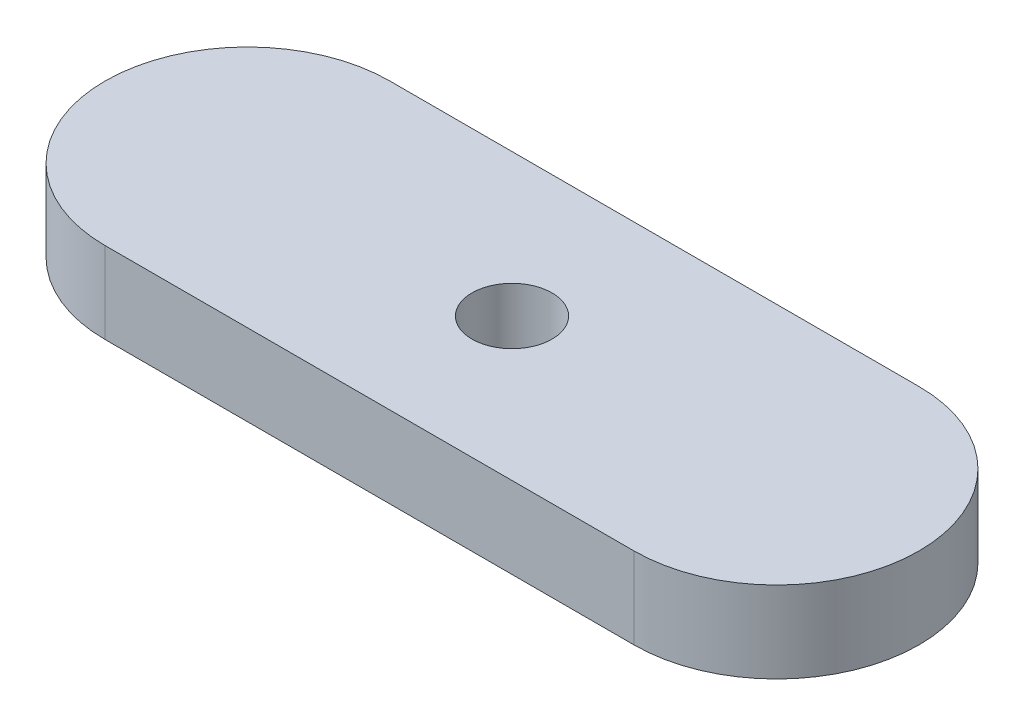
ISO-10303-21;
HEADER;
FILE_DESCRIPTION(('STEP AP214'),'2;1');
FILE_NAME('part.step','',(''),(''),'','','');
FILE_SCHEMA(('AUTOMOTIVE_DESIGN { 1 0 10303 214 1 1 1 1 }'));
ENDSEC;
DATA;
#1=APPLICATION_CONTEXT('core data for automotive mechanical design processes');
#2=APPLICATION_PROTOCOL_DEFINITION('international standard','automotive_design',2000,#1);
#3=PRODUCT_CONTEXT('',#1,'mechanical');
#4=PRODUCT('Part','Part','',(#3));
#5=PRODUCT_RELATED_PRODUCT_CATEGORY('part','',(#4));
#6=PRODUCT_DEFINITION_FORMATION('','',#4);
#7=PRODUCT_DEFINITION_CONTEXT('part definition',#1,'design');
#8=PRODUCT_DEFINITION('design','',#6,#7);
#9=PRODUCT_DEFINITION_SHAPE('','',#8);
#10=(LENGTH_UNIT() NAMED_UNIT(*) SI_UNIT(.MILLI.,.METRE.));
#11=(NAMED_UNIT(*) PLANE_ANGLE_UNIT() SI_UNIT($,.RADIAN.));
#12=(NAMED_UNIT(*) SI_UNIT($,.STERADIAN.) SOLID_ANGLE_UNIT());
#13=UNCERTAINTY_MEASURE_WITH_UNIT(LENGTH_MEASURE(1.E-05),#10,'distance_accuracy_value','');
#14=(GEOMETRIC_REPRESENTATION_CONTEXT(3) GLOBAL_UNCERTAINTY_ASSIGNED_CONTEXT((#13)) GLOBAL_UNIT_ASSIGNED_CONTEXT((#10,
#11,#12)) REPRESENTATION_CONTEXT('',''));
#15=CARTESIAN_POINT('',(0.,0.,0.));
#16=DIRECTION('',(0.,0.,1.));
#17=DIRECTION('',(1.,0.,0.));
#18=AXIS2_PLACEMENT_3D('',#15,#16,#17);
#19=CARTESIAN_POINT('',(0.,2.54,0.));
#20=DIRECTION('',(0.,1.,0.));
#21=DIRECTION('',(0.,0.,1.));
#22=AXIS2_PLACEMENT_3D('',#19,#20,#21);
#23=PLANE('',#22);
#24=CARTESIAN_POINT('',(0.,2.54,0.));
#25=DIRECTION('',(0.,1.,0.));
#26=DIRECTION('',(0.,0.,1.));
#27=AXIS2_PLACEMENT_3D('',#24,#25,#26);
#28=CIRCLE('',#27,4.445);
#29=CARTESIAN_POINT('',(0.,2.54,-4.445));
#30=VERTEX_POINT('',#29);
#31=CARTESIAN_POINT('',(0.,2.54,4.445));
#32=VERTEX_POINT('',#31);
#33=EDGE_CURVE('E87',#30,#32,#28,.T.);
#34=ORIENTED_EDGE('',*,*,#33,.T.);
#35=DIRECTION('',(1.,0.,0.));
#36=VECTOR('',#35,1.);
#37=CARTESIAN_POINT('',(0.,2.54,4.445));
#38=LINE('',#37,#36);
#39=CARTESIAN_POINT('',(16.51,2.54,4.445));
#40=VERTEX_POINT('',#39);
#41=EDGE_CURVE('E82',#32,#40,#38,.T.);
#42=ORIENTED_EDGE('',*,*,#41,.T.);
#43=CARTESIAN_POINT('',(16.51,2.54,0.));
#44=DIRECTION('',(0.,1.,0.));
#45=DIRECTION('',(0.,0.,1.));
#46=AXIS2_PLACEMENT_3D('',#43,#44,#45);
#47=CIRCLE('',#46,4.445);
#48=CARTESIAN_POINT('',(16.51,2.54,-4.445));
#49=VERTEX_POINT('',#48);
#50=EDGE_CURVE('E85',#40,#49,#47,.T.);
#51=ORIENTED_EDGE('',*,*,#50,.T.);
#52=DIRECTION('',(-1.,0.,0.));
#53=VECTOR('',#52,1.);
#54=CARTESIAN_POINT('',(0.,2.54,-4.445));
#55=LINE('',#54,#53);
#56=EDGE_CURVE('E52',#49,#30,#55,.T.);
#57=ORIENTED_EDGE('',*,*,#56,.T.);
#58=EDGE_LOOP('',(#34,#42,#51,#57));
#59=FACE_BOUND('',#58,.T.);
#60=CARTESIAN_POINT('',(8.255,2.54,0.));
#61=DIRECTION('',(0.,1.,0.));
#62=DIRECTION('',(0.,0.,1.));
#63=AXIS2_PLACEMENT_3D('',#60,#61,#62);
#64=CIRCLE('',#63,1.25);
#65=CARTESIAN_POINT('',(8.255,2.54,1.25));
#66=VERTEX_POINT('',#65);
#67=EDGE_CURVE('E102',#66,#66,#64,.T.);
#68=ORIENTED_EDGE('',*,*,#67,.F.);
#69=EDGE_LOOP('',(#68));
#70=FACE_BOUND('',#69,.T.);
#71=ADVANCED_FACE('F35',(#59,#70),#23,.T.);
#72=CARTESIAN_POINT('',(0.,0.,0.));
#73=DIRECTION('',(0.,1.,0.));
#74=DIRECTION('',(0.,0.,1.));
#75=AXIS2_PLACEMENT_3D('',#72,#73,#74);
#76=PLANE('',#75);
#77=CARTESIAN_POINT('',(0.,0.,0.));
#78=DIRECTION('',(0.,1.,0.));
#79=DIRECTION('',(0.,0.,1.));
#80=AXIS2_PLACEMENT_3D('',#77,#78,#79);
#81=CIRCLE('',#80,4.445);
#82=CARTESIAN_POINT('',(0.,0.,-4.445));
#83=VERTEX_POINT('',#82);
#84=CARTESIAN_POINT('',(0.,0.,4.445));
#85=VERTEX_POINT('',#84);
#86=EDGE_CURVE('E99',#83,#85,#81,.T.);
#87=ORIENTED_EDGE('',*,*,#86,.F.);
#88=DIRECTION('',(-1.,0.,0.));
#89=VECTOR('',#88,1.);
#90=CARTESIAN_POINT('',(0.,0.,-4.445));
#91=LINE('',#90,#89);
#92=CARTESIAN_POINT('',(16.51,0.,-4.445));
#93=VERTEX_POINT('',#92);
#94=EDGE_CURVE('E75',#93,#83,#91,.T.);
#95=ORIENTED_EDGE('',*,*,#94,.F.);
#96=CARTESIAN_POINT('',(16.51,0.,0.));
#97=DIRECTION('',(0.,1.,0.));
#98=DIRECTION('',(0.,0.,1.));
#99=AXIS2_PLACEMENT_3D('',#96,#97,#98);
#100=CIRCLE('',#99,4.445);
#101=CARTESIAN_POINT('',(16.51,0.,4.445));
#102=VERTEX_POINT('',#101);
#103=EDGE_CURVE('E69',#102,#93,#100,.T.);
#104=ORIENTED_EDGE('',*,*,#103,.F.);
#105=DIRECTION('',(1.,0.,0.));
#106=VECTOR('',#105,1.);
#107=CARTESIAN_POINT('',(0.,0.,4.445));
#108=LINE('',#107,#106);
#109=EDGE_CURVE('E91',#85,#102,#108,.T.);
#110=ORIENTED_EDGE('',*,*,#109,.F.);
#111=EDGE_LOOP('',(#87,#95,#104,#110));
#112=FACE_BOUND('',#111,.T.);
#113=CARTESIAN_POINT('',(8.255,0.,0.));
#114=DIRECTION('',(0.,1.,0.));
#115=DIRECTION('',(0.,0.,1.));
#116=AXIS2_PLACEMENT_3D('',#113,#114,#115);
#117=CIRCLE('',#116,1.25);
#118=CARTESIAN_POINT('',(8.255,0.,1.25));
#119=VERTEX_POINT('',#118);
#120=EDGE_CURVE('E114',#119,#119,#117,.T.);
#121=ORIENTED_EDGE('',*,*,#120,.T.);
#122=EDGE_LOOP('',(#121));
#123=FACE_BOUND('',#122,.T.);
#124=ADVANCED_FACE('F110',(#112,#123),#76,.F.);
#125=CARTESIAN_POINT('',(0.,2.54,0.));
#126=DIRECTION('',(0.,-1.,0.));
#127=DIRECTION('',(0.,0.,-1.));
#128=AXIS2_PLACEMENT_3D('',#125,#126,#127);
#129=CYLINDRICAL_SURFACE('',#128,4.445);
#130=ORIENTED_EDGE('',*,*,#86,.T.);
#131=DIRECTION('',(0.,-1.,0.));
#132=VECTOR('',#131,1.);
#133=CARTESIAN_POINT('',(0.,2.54,4.445));
#134=LINE('',#133,#132);
#135=EDGE_CURVE('E11',#32,#85,#134,.T.);
#136=ORIENTED_EDGE('',*,*,#135,.F.);
#137=ORIENTED_EDGE('',*,*,#33,.F.);
#138=DIRECTION('',(0.,-1.,0.));
#139=VECTOR('',#138,1.);
#140=CARTESIAN_POINT('',(0.,2.54,-4.445));
#141=LINE('',#140,#139);
#142=EDGE_CURVE('E95',#30,#83,#141,.T.);
#143=ORIENTED_EDGE('',*,*,#142,.T.);
#144=EDGE_LOOP('',(#130,#136,#137,#143));
#145=FACE_BOUND('',#144,.T.);
#146=ADVANCED_FACE('F37',(#145),#129,.T.);
#147=CARTESIAN_POINT('',(0.,2.54,4.445));
#148=DIRECTION('',(0.,0.,-1.));
#149=DIRECTION('',(-1.,0.,0.));
#150=AXIS2_PLACEMENT_3D('',#147,#148,#149);
#151=PLANE('',#150);
#152=ORIENTED_EDGE('',*,*,#109,.T.);
#153=DIRECTION('',(0.,-1.,0.));
#154=VECTOR('',#153,1.);
#155=CARTESIAN_POINT('',(16.51,2.54,4.445));
#156=LINE('',#155,#154);
#157=EDGE_CURVE('E44',#40,#102,#156,.T.);
#158=ORIENTED_EDGE('',*,*,#157,.F.);
#159=ORIENTED_EDGE('',*,*,#41,.F.);
#160=ORIENTED_EDGE('',*,*,#135,.T.);
#161=EDGE_LOOP('',(#152,#158,#159,#160));
#162=FACE_BOUND('',#161,.T.);
#163=ADVANCED_FACE('F90',(#162),#151,.F.);
#164=CARTESIAN_POINT('',(16.51,2.54,0.));
#165=DIRECTION('',(0.,-1.,0.));
#166=DIRECTION('',(0.,0.,-1.));
#167=AXIS2_PLACEMENT_3D('',#164,#165,#166);
#168=CYLINDRICAL_SURFACE('',#167,4.445);
#169=ORIENTED_EDGE('',*,*,#103,.T.);
#170=DIRECTION('',(0.,-1.,0.));
#171=VECTOR('',#170,1.);
#172=CARTESIAN_POINT('',(16.51,2.54,-4.445));
#173=LINE('',#172,#171);
#174=EDGE_CURVE('E92',#49,#93,#173,.T.);
#175=ORIENTED_EDGE('',*,*,#174,.F.);
#176=ORIENTED_EDGE('',*,*,#50,.F.);
#177=ORIENTED_EDGE('',*,*,#157,.T.);
#178=EDGE_LOOP('',(#169,#175,#176,#177));
#179=FACE_BOUND('',#178,.T.);
#180=ADVANCED_FACE('F93',(#179),#168,.T.);
#181=CARTESIAN_POINT('',(0.,2.54,-4.445));
#182=DIRECTION('',(0.,0.,1.));
#183=DIRECTION('',(1.,0.,0.));
#184=AXIS2_PLACEMENT_3D('',#181,#182,#183);
#185=PLANE('',#184);
#186=ORIENTED_EDGE('',*,*,#94,.T.);
#187=ORIENTED_EDGE('',*,*,#142,.F.);
#188=ORIENTED_EDGE('',*,*,#56,.F.);
#189=ORIENTED_EDGE('',*,*,#174,.T.);
#190=EDGE_LOOP('',(#186,#187,#188,#189));
#191=FACE_BOUND('',#190,.T.);
#192=ADVANCED_FACE('F107',(#191),#185,.F.);
#193=CARTESIAN_POINT('',(8.255,2.54,0.));
#194=DIRECTION('',(0.,-1.,0.));
#195=DIRECTION('',(0.,0.,-1.));
#196=AXIS2_PLACEMENT_3D('',#193,#194,#195);
#197=CYLINDRICAL_SURFACE('',#196,1.25);
#198=ORIENTED_EDGE('',*,*,#67,.T.);
#199=EDGE_LOOP('',(#198));
#200=FACE_BOUND('',#199,.T.);
#201=ORIENTED_EDGE('',*,*,#120,.F.);
#202=EDGE_LOOP('',(#201));
#203=FACE_BOUND('',#202,.T.);
#204=ADVANCED_FACE('F120',(#200,#203),#197,.F.);
#205=CLOSED_SHELL('',(#71,#124,#146,#163,#180,#192,#204));
#206=MANIFOLD_SOLID_BREP('B2',#205);
#207=ADVANCED_BREP_SHAPE_REPRESENTATION('',(#18,#206),#14);
#208=SHAPE_DEFINITION_REPRESENTATION(#9,#207);
ENDSEC;
END-ISO-10303-21;
